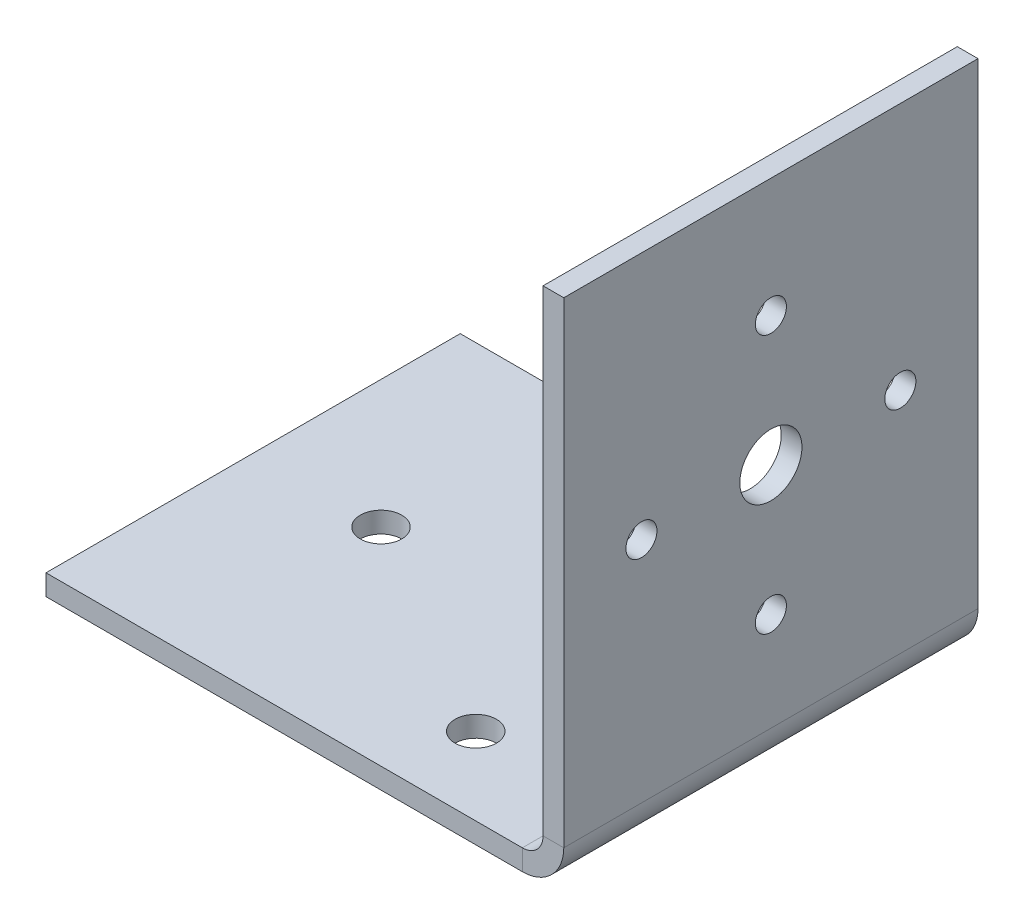
ISO-10303-21;
HEADER;
FILE_DESCRIPTION(('STEP AP214'),'2;1');
FILE_NAME('part.step','',(''),(''),'','','');
FILE_SCHEMA(('AUTOMOTIVE_DESIGN { 1 0 10303 214 1 1 1 1 }'));
ENDSEC;
DATA;
#1=APPLICATION_CONTEXT('core data for automotive mechanical design processes');
#2=APPLICATION_PROTOCOL_DEFINITION('international standard','automotive_design',2000,#1);
#3=PRODUCT_CONTEXT('',#1,'mechanical');
#4=PRODUCT('Part','Part','',(#3));
#5=PRODUCT_RELATED_PRODUCT_CATEGORY('part','',(#4));
#6=PRODUCT_DEFINITION_FORMATION('','',#4);
#7=PRODUCT_DEFINITION_CONTEXT('part definition',#1,'design');
#8=PRODUCT_DEFINITION('design','',#6,#7);
#9=PRODUCT_DEFINITION_SHAPE('','',#8);
#10=(LENGTH_UNIT() NAMED_UNIT(*) SI_UNIT(.MILLI.,.METRE.));
#11=(NAMED_UNIT(*) PLANE_ANGLE_UNIT() SI_UNIT($,.RADIAN.));
#12=(NAMED_UNIT(*) SI_UNIT($,.STERADIAN.) SOLID_ANGLE_UNIT());
#13=UNCERTAINTY_MEASURE_WITH_UNIT(LENGTH_MEASURE(1.E-05),#10,'distance_accuracy_value','');
#14=(GEOMETRIC_REPRESENTATION_CONTEXT(3) GLOBAL_UNCERTAINTY_ASSIGNED_CONTEXT((#13)) GLOBAL_UNIT_ASSIGNED_CONTEXT((#10,
#11,#12)) REPRESENTATION_CONTEXT('',''));
#15=CARTESIAN_POINT('',(0.,0.,0.));
#16=DIRECTION('',(0.,0.,1.));
#17=DIRECTION('',(1.,0.,0.));
#18=AXIS2_PLACEMENT_3D('',#15,#16,#17);
#19=CARTESIAN_POINT('',(25.,0.,-20.));
#20=DIRECTION('',(0.,0.,1.));
#21=DIRECTION('',(0.,1.,0.));
#22=AXIS2_PLACEMENT_3D('',#19,#20,#21);
#23=PLANE('',#22);
#24=DIRECTION('',(1.,0.,0.));
#25=VECTOR('',#24,1.);
#26=CARTESIAN_POINT('',(25.,3.,-20.));
#27=LINE('',#26,#25);
#28=CARTESIAN_POINT('',(23.,3.,-20.));
#29=VERTEX_POINT('',#28);
#30=CARTESIAN_POINT('',(25.,3.,-20.));
#31=VERTEX_POINT('',#30);
#32=EDGE_CURVE('E11',#29,#31,#27,.T.);
#33=ORIENTED_EDGE('',*,*,#32,.F.);
#34=DIRECTION('',(0.,1.,0.));
#35=VECTOR('',#34,1.);
#36=CARTESIAN_POINT('',(23.,0.,-20.));
#37=LINE('',#36,#35);
#38=CARTESIAN_POINT('',(23.,49.,-20.));
#39=VERTEX_POINT('',#38);
#40=EDGE_CURVE('E97',#29,#39,#37,.T.);
#41=ORIENTED_EDGE('',*,*,#40,.T.);
#42=DIRECTION('',(1.,0.,0.));
#43=VECTOR('',#42,1.);
#44=CARTESIAN_POINT('',(25.,49.,-20.));
#45=LINE('',#44,#43);
#46=CARTESIAN_POINT('',(25.,49.,-20.));
#47=VERTEX_POINT('',#46);
#48=EDGE_CURVE('E57',#39,#47,#45,.T.);
#49=ORIENTED_EDGE('',*,*,#48,.T.);
#50=DIRECTION('',(0.,1.,0.));
#51=VECTOR('',#50,1.);
#52=CARTESIAN_POINT('',(25.,0.,-20.));
#53=LINE('',#52,#51);
#54=EDGE_CURVE('E99',#31,#47,#53,.T.);
#55=ORIENTED_EDGE('',*,*,#54,.F.);
#56=EDGE_LOOP('',(#33,#41,#49,#55));
#57=FACE_BOUND('',#56,.T.);
#58=ADVANCED_FACE('F46',(#57),#23,.F.);
#59=CARTESIAN_POINT('',(25.,49.,20.));
#60=DIRECTION('',(0.,1.,0.));
#61=DIRECTION('',(0.,0.,-1.));
#62=AXIS2_PLACEMENT_3D('',#59,#60,#61);
#63=PLANE('',#62);
#64=ORIENTED_EDGE('',*,*,#48,.F.);
#65=DIRECTION('',(0.,0.,1.));
#66=VECTOR('',#65,1.);
#67=CARTESIAN_POINT('',(23.,49.,20.));
#68=LINE('',#67,#66);
#69=CARTESIAN_POINT('',(23.,49.,20.));
#70=VERTEX_POINT('',#69);
#71=EDGE_CURVE('E123',#70,#39,#68,.F.);
#72=ORIENTED_EDGE('',*,*,#71,.F.);
#73=DIRECTION('',(1.,0.,0.));
#74=VECTOR('',#73,1.);
#75=CARTESIAN_POINT('',(25.,49.,20.));
#76=LINE('',#75,#74);
#77=CARTESIAN_POINT('',(25.,49.,20.));
#78=VERTEX_POINT('',#77);
#79=EDGE_CURVE('E155',#70,#78,#76,.T.);
#80=ORIENTED_EDGE('',*,*,#79,.T.);
#81=DIRECTION('',(0.,0.,-1.));
#82=VECTOR('',#81,1.);
#83=CARTESIAN_POINT('',(25.,49.,20.));
#84=LINE('',#83,#82);
#85=EDGE_CURVE('E195',#78,#47,#84,.T.);
#86=ORIENTED_EDGE('',*,*,#85,.T.);
#87=EDGE_LOOP('',(#64,#72,#80,#86));
#88=FACE_BOUND('',#87,.T.);
#89=ADVANCED_FACE('F222',(#88),#63,.T.);
#90=CARTESIAN_POINT('',(25.,0.,20.));
#91=DIRECTION('',(0.,0.,1.));
#92=DIRECTION('',(0.,1.,0.));
#93=AXIS2_PLACEMENT_3D('',#90,#91,#92);
#94=PLANE('',#93);
#95=ORIENTED_EDGE('',*,*,#79,.F.);
#96=DIRECTION('',(0.,1.,0.));
#97=VECTOR('',#96,1.);
#98=CARTESIAN_POINT('',(23.,0.,20.));
#99=LINE('',#98,#97);
#100=CARTESIAN_POINT('',(23.,3.,20.));
#101=VERTEX_POINT('',#100);
#102=EDGE_CURVE('E217',#101,#70,#99,.T.);
#103=ORIENTED_EDGE('',*,*,#102,.F.);
#104=DIRECTION('',(1.,0.,0.));
#105=VECTOR('',#104,1.);
#106=CARTESIAN_POINT('',(25.,3.,20.));
#107=LINE('',#106,#105);
#108=CARTESIAN_POINT('',(25.,3.,20.));
#109=VERTEX_POINT('',#108);
#110=EDGE_CURVE('E148',#101,#109,#107,.T.);
#111=ORIENTED_EDGE('',*,*,#110,.T.);
#112=DIRECTION('',(0.,1.,0.));
#113=VECTOR('',#112,1.);
#114=CARTESIAN_POINT('',(25.,0.,20.));
#115=LINE('',#114,#113);
#116=EDGE_CURVE('E194',#109,#78,#115,.T.);
#117=ORIENTED_EDGE('',*,*,#116,.T.);
#118=EDGE_LOOP('',(#95,#103,#111,#117));
#119=FACE_BOUND('',#118,.T.);
#120=ADVANCED_FACE('F259',(#119),#94,.T.);
#121=CARTESIAN_POINT('',(21.,3.,20.));
#122=DIRECTION('',(0.,0.,-1.));
#123=DIRECTION('',(-1.,0.,0.));
#124=AXIS2_PLACEMENT_3D('',#121,#122,#123);
#125=PLANE('',#124);
#126=ORIENTED_EDGE('',*,*,#110,.F.);
#127=CARTESIAN_POINT('',(21.,3.,20.));
#128=DIRECTION('',(0.,0.,-1.));
#129=DIRECTION('',(-1.,0.,0.));
#130=AXIS2_PLACEMENT_3D('',#127,#128,#129);
#131=CIRCLE('',#130,2.);
#132=CARTESIAN_POINT('',(21.,1.,20.));
#133=VERTEX_POINT('',#132);
#134=EDGE_CURVE('E114',#101,#133,#131,.T.);
#135=ORIENTED_EDGE('',*,*,#134,.T.);
#136=DIRECTION('',(0.,-1.,0.));
#137=VECTOR('',#136,1.);
#138=CARTESIAN_POINT('',(21.,-1.,20.));
#139=LINE('',#138,#137);
#140=CARTESIAN_POINT('',(21.,-1.,20.));
#141=VERTEX_POINT('',#140);
#142=EDGE_CURVE('E64',#133,#141,#139,.T.);
#143=ORIENTED_EDGE('',*,*,#142,.T.);
#144=CARTESIAN_POINT('',(21.,3.,20.));
#145=DIRECTION('',(0.,0.,1.));
#146=DIRECTION('',(1.,0.,0.));
#147=AXIS2_PLACEMENT_3D('',#144,#145,#146);
#148=CIRCLE('',#147,4.);
#149=EDGE_CURVE('E188',#109,#141,#148,.F.);
#150=ORIENTED_EDGE('',*,*,#149,.F.);
#151=EDGE_LOOP('',(#126,#135,#143,#150));
#152=FACE_BOUND('',#151,.T.);
#153=ADVANCED_FACE('F257',(#152),#125,.F.);
#154=CARTESIAN_POINT('',(0.,-1.,20.));
#155=DIRECTION('',(0.,0.,1.));
#156=DIRECTION('',(1.,0.,0.));
#157=AXIS2_PLACEMENT_3D('',#154,#155,#156);
#158=PLANE('',#157);
#159=ORIENTED_EDGE('',*,*,#142,.F.);
#160=DIRECTION('',(1.,0.,0.));
#161=VECTOR('',#160,1.);
#162=CARTESIAN_POINT('',(0.,1.,20.));
#163=LINE('',#162,#161);
#164=CARTESIAN_POINT('',(-25.,1.,20.));
#165=VERTEX_POINT('',#164);
#166=EDGE_CURVE('E220',#165,#133,#163,.T.);
#167=ORIENTED_EDGE('',*,*,#166,.F.);
#168=DIRECTION('',(0.,-1.,0.));
#169=VECTOR('',#168,1.);
#170=CARTESIAN_POINT('',(-25.,-1.,20.));
#171=LINE('',#170,#169);
#172=CARTESIAN_POINT('',(-25.,-1.,20.));
#173=VERTEX_POINT('',#172);
#174=EDGE_CURVE('E143',#165,#173,#171,.T.);
#175=ORIENTED_EDGE('',*,*,#174,.T.);
#176=DIRECTION('',(1.,0.,0.));
#177=VECTOR('',#176,1.);
#178=CARTESIAN_POINT('',(0.,-1.,20.));
#179=LINE('',#178,#177);
#180=EDGE_CURVE('E202',#173,#141,#179,.T.);
#181=ORIENTED_EDGE('',*,*,#180,.T.);
#182=EDGE_LOOP('',(#159,#167,#175,#181));
#183=FACE_BOUND('',#182,.T.);
#184=ADVANCED_FACE('F244',(#183),#158,.T.);
#185=CARTESIAN_POINT('',(-25.,-1.,20.));
#186=DIRECTION('',(1.,0.,0.));
#187=DIRECTION('',(0.,0.,-1.));
#188=AXIS2_PLACEMENT_3D('',#185,#186,#187);
#189=PLANE('',#188);
#190=ORIENTED_EDGE('',*,*,#174,.F.);
#191=DIRECTION('',(0.,0.,1.));
#192=VECTOR('',#191,1.);
#193=CARTESIAN_POINT('',(-25.,1.,20.));
#194=LINE('',#193,#192);
#195=CARTESIAN_POINT('',(-25.,1.,-20.));
#196=VERTEX_POINT('',#195);
#197=EDGE_CURVE('E119',#165,#196,#194,.F.);
#198=ORIENTED_EDGE('',*,*,#197,.T.);
#199=DIRECTION('',(0.,-1.,0.));
#200=VECTOR('',#199,1.);
#201=CARTESIAN_POINT('',(-25.,-1.,-20.));
#202=LINE('',#201,#200);
#203=CARTESIAN_POINT('',(-25.,-1.,-20.));
#204=VERTEX_POINT('',#203);
#205=EDGE_CURVE('E145',#196,#204,#202,.T.);
#206=ORIENTED_EDGE('',*,*,#205,.T.);
#207=DIRECTION('',(0.,0.,-1.));
#208=VECTOR('',#207,1.);
#209=CARTESIAN_POINT('',(-25.,-1.,20.));
#210=LINE('',#209,#208);
#211=EDGE_CURVE('E201',#173,#204,#210,.T.);
#212=ORIENTED_EDGE('',*,*,#211,.F.);
#213=EDGE_LOOP('',(#190,#198,#206,#212));
#214=FACE_BOUND('',#213,.T.);
#215=ADVANCED_FACE('F252',(#214),#189,.F.);
#216=CARTESIAN_POINT('',(0.,-1.,-20.));
#217=DIRECTION('',(0.,0.,1.));
#218=DIRECTION('',(1.,0.,0.));
#219=AXIS2_PLACEMENT_3D('',#216,#217,#218);
#220=PLANE('',#219);
#221=ORIENTED_EDGE('',*,*,#205,.F.);
#222=DIRECTION('',(1.,0.,0.));
#223=VECTOR('',#222,1.);
#224=CARTESIAN_POINT('',(0.,1.,-20.));
#225=LINE('',#224,#223);
#226=CARTESIAN_POINT('',(21.,1.,-20.));
#227=VERTEX_POINT('',#226);
#228=EDGE_CURVE('E214',#196,#227,#225,.T.);
#229=ORIENTED_EDGE('',*,*,#228,.T.);
#230=DIRECTION('',(0.,-1.,0.));
#231=VECTOR('',#230,1.);
#232=CARTESIAN_POINT('',(21.,-1.,-20.));
#233=LINE('',#232,#231);
#234=CARTESIAN_POINT('',(21.,-1.,-20.));
#235=VERTEX_POINT('',#234);
#236=EDGE_CURVE('E129',#227,#235,#233,.T.);
#237=ORIENTED_EDGE('',*,*,#236,.T.);
#238=DIRECTION('',(1.,0.,0.));
#239=VECTOR('',#238,1.);
#240=CARTESIAN_POINT('',(0.,-1.,-20.));
#241=LINE('',#240,#239);
#242=EDGE_CURVE('E199',#204,#235,#241,.T.);
#243=ORIENTED_EDGE('',*,*,#242,.F.);
#244=EDGE_LOOP('',(#221,#229,#237,#243));
#245=FACE_BOUND('',#244,.T.);
#246=ADVANCED_FACE('F253',(#245),#220,.F.);
#247=CARTESIAN_POINT('',(25.,25.02,0.));
#248=DIRECTION('',(-1.,0.,0.));
#249=DIRECTION('',(0.,0.,1.));
#250=AXIS2_PLACEMENT_3D('',#247,#248,#249);
#251=CYLINDRICAL_SURFACE('',#250,3.);
#252=CARTESIAN_POINT('',(25.,25.02,0.));
#253=DIRECTION('',(1.,0.,0.));
#254=DIRECTION('',(0.,0.,-1.));
#255=AXIS2_PLACEMENT_3D('',#252,#253,#254);
#256=CIRCLE('',#255,3.);
#257=CARTESIAN_POINT('',(25.,25.02,-3.));
#258=VERTEX_POINT('',#257);
#259=EDGE_CURVE('E190',#258,#258,#256,.T.);
#260=ORIENTED_EDGE('',*,*,#259,.T.);
#261=EDGE_LOOP('',(#260));
#262=FACE_BOUND('',#261,.T.);
#263=CARTESIAN_POINT('',(23.,25.02,0.));
#264=DIRECTION('',(1.,0.,0.));
#265=DIRECTION('',(0.,0.,-1.));
#266=AXIS2_PLACEMENT_3D('',#263,#264,#265);
#267=CIRCLE('',#266,3.);
#268=CARTESIAN_POINT('',(23.,25.02,-3.));
#269=VERTEX_POINT('',#268);
#270=EDGE_CURVE('E126',#269,#269,#267,.T.);
#271=ORIENTED_EDGE('',*,*,#270,.F.);
#272=EDGE_LOOP('',(#271));
#273=FACE_BOUND('',#272,.T.);
#274=ADVANCED_FACE('F48',(#262,#273),#251,.F.);
#275=CARTESIAN_POINT('',(21.,3.,-20.));
#276=DIRECTION('',(0.,0.,1.));
#277=DIRECTION('',(1.,0.,0.));
#278=AXIS2_PLACEMENT_3D('',#275,#276,#277);
#279=PLANE('',#278);
#280=CARTESIAN_POINT('',(21.,3.,-20.));
#281=DIRECTION('',(0.,0.,-1.));
#282=DIRECTION('',(-1.,0.,0.));
#283=AXIS2_PLACEMENT_3D('',#280,#281,#282);
#284=CIRCLE('',#283,2.);
#285=EDGE_CURVE('E113',#227,#29,#284,.F.);
#286=ORIENTED_EDGE('',*,*,#285,.T.);
#287=ORIENTED_EDGE('',*,*,#32,.T.);
#288=CARTESIAN_POINT('',(21.,3.,-20.));
#289=DIRECTION('',(0.,0.,-1.));
#290=DIRECTION('',(-1.,0.,0.));
#291=AXIS2_PLACEMENT_3D('',#288,#289,#290);
#292=CIRCLE('',#291,4.);
#293=EDGE_CURVE('E211',#235,#31,#292,.F.);
#294=ORIENTED_EDGE('',*,*,#293,.F.);
#295=ORIENTED_EDGE('',*,*,#236,.F.);
#296=EDGE_LOOP('',(#286,#287,#294,#295));
#297=FACE_BOUND('',#296,.T.);
#298=ADVANCED_FACE('F128',(#297),#279,.F.);
#299=CARTESIAN_POINT('',(0.,-1.,20.));
#300=DIRECTION('',(0.,1.,0.));
#301=DIRECTION('',(0.,0.,1.));
#302=AXIS2_PLACEMENT_3D('',#299,#300,#301);
#303=PLANE('',#302);
#304=CARTESIAN_POINT('',(8.9999999999999,-1.,12.5000000000001));
#305=DIRECTION('',(0.,-1.,0.));
#306=DIRECTION('',(0.,0.,-1.));
#307=AXIS2_PLACEMENT_3D('',#304,#305,#306);
#308=CIRCLE('',#307,2.);
#309=CARTESIAN_POINT('',(8.9999999999999,-1.,10.5000000000001));
#310=VERTEX_POINT('',#309);
#311=EDGE_CURVE('E163',#310,#310,#308,.T.);
#312=ORIENTED_EDGE('',*,*,#311,.F.);
#313=EDGE_LOOP('',(#312));
#314=FACE_BOUND('',#313,.T.);
#315=CARTESIAN_POINT('',(8.9999999999999,-1.,-12.4999999999999));
#316=DIRECTION('',(0.,-1.,0.));
#317=DIRECTION('',(0.,0.,-1.));
#318=AXIS2_PLACEMENT_3D('',#315,#316,#317);
#319=CIRCLE('',#318,2.);
#320=CARTESIAN_POINT('',(8.9999999999999,-1.,-14.4999999999999));
#321=VERTEX_POINT('',#320);
#322=EDGE_CURVE('E177',#321,#321,#319,.T.);
#323=ORIENTED_EDGE('',*,*,#322,.F.);
#324=EDGE_LOOP('',(#323));
#325=FACE_BOUND('',#324,.T.);
#326=CARTESIAN_POINT('',(-12.6506350946111,-1.,0.));
#327=DIRECTION('',(0.,-1.,0.));
#328=DIRECTION('',(0.,0.,-1.));
#329=AXIS2_PLACEMENT_3D('',#326,#327,#328);
#330=CIRCLE('',#329,2.);
#331=CARTESIAN_POINT('',(-12.6506350946111,-1.,-1.99999999999994));
#332=VERTEX_POINT('',#331);
#333=EDGE_CURVE('E174',#332,#332,#330,.T.);
#334=ORIENTED_EDGE('',*,*,#333,.F.);
#335=EDGE_LOOP('',(#334));
#336=FACE_BOUND('',#335,.T.);
#337=ORIENTED_EDGE('',*,*,#242,.T.);
#338=DIRECTION('',(0.,0.,-1.));
#339=VECTOR('',#338,1.);
#340=CARTESIAN_POINT('',(21.,-1.,20.));
#341=LINE('',#340,#339);
#342=EDGE_CURVE('E160',#235,#141,#341,.F.);
#343=ORIENTED_EDGE('',*,*,#342,.T.);
#344=ORIENTED_EDGE('',*,*,#180,.F.);
#345=ORIENTED_EDGE('',*,*,#211,.T.);
#346=EDGE_LOOP('',(#337,#343,#344,#345));
#347=FACE_BOUND('',#346,.T.);
#348=ADVANCED_FACE('F249',(#314,#325,#336,#347),#303,.F.);
#349=CARTESIAN_POINT('',(25.,0.,20.));
#350=DIRECTION('',(-1.,0.,0.));
#351=DIRECTION('',(0.,0.,1.));
#352=AXIS2_PLACEMENT_3D('',#349,#350,#351);
#353=PLANE('',#352);
#354=CARTESIAN_POINT('',(25.,37.52,0.));
#355=DIRECTION('',(1.,0.,0.));
#356=DIRECTION('',(0.,0.,-1.));
#357=AXIS2_PLACEMENT_3D('',#354,#355,#356);
#358=CIRCLE('',#357,1.5);
#359=CARTESIAN_POINT('',(25.,37.52,-1.5));
#360=VERTEX_POINT('',#359);
#361=EDGE_CURVE('E166',#360,#360,#358,.T.);
#362=ORIENTED_EDGE('',*,*,#361,.F.);
#363=EDGE_LOOP('',(#362));
#364=FACE_BOUND('',#363,.T.);
#365=CARTESIAN_POINT('',(25.,25.02,-12.5));
#366=DIRECTION('',(1.,0.,0.));
#367=DIRECTION('',(0.,0.,-1.));
#368=AXIS2_PLACEMENT_3D('',#365,#366,#367);
#369=CIRCLE('',#368,1.5);
#370=CARTESIAN_POINT('',(25.,25.02,-14.));
#371=VERTEX_POINT('',#370);
#372=EDGE_CURVE('E523',#371,#371,#369,.T.);
#373=ORIENTED_EDGE('',*,*,#372,.F.);
#374=EDGE_LOOP('',(#373));
#375=FACE_BOUND('',#374,.T.);
#376=CARTESIAN_POINT('',(25.,12.52,0.));
#377=DIRECTION('',(1.,0.,0.));
#378=DIRECTION('',(0.,0.,-1.));
#379=AXIS2_PLACEMENT_3D('',#376,#377,#378);
#380=CIRCLE('',#379,1.5);
#381=CARTESIAN_POINT('',(25.,12.52,-1.5));
#382=VERTEX_POINT('',#381);
#383=EDGE_CURVE('E529',#382,#382,#380,.T.);
#384=ORIENTED_EDGE('',*,*,#383,.F.);
#385=EDGE_LOOP('',(#384));
#386=FACE_BOUND('',#385,.T.);
#387=CARTESIAN_POINT('',(25.,25.02,12.5));
#388=DIRECTION('',(1.,0.,0.));
#389=DIRECTION('',(0.,0.,-1.));
#390=AXIS2_PLACEMENT_3D('',#387,#388,#389);
#391=CIRCLE('',#390,1.5);
#392=CARTESIAN_POINT('',(25.,25.02,11.));
#393=VERTEX_POINT('',#392);
#394=EDGE_CURVE('E535',#393,#393,#391,.T.);
#395=ORIENTED_EDGE('',*,*,#394,.F.);
#396=EDGE_LOOP('',(#395));
#397=FACE_BOUND('',#396,.T.);
#398=ORIENTED_EDGE('',*,*,#259,.F.);
#399=EDGE_LOOP('',(#398));
#400=FACE_BOUND('',#399,.T.);
#401=ORIENTED_EDGE('',*,*,#116,.F.);
#402=DIRECTION('',(0.,0.,-1.));
#403=VECTOR('',#402,1.);
#404=CARTESIAN_POINT('',(25.,3.,20.));
#405=LINE('',#404,#403);
#406=EDGE_CURVE('E210',#109,#31,#405,.T.);
#407=ORIENTED_EDGE('',*,*,#406,.T.);
#408=ORIENTED_EDGE('',*,*,#54,.T.);
#409=ORIENTED_EDGE('',*,*,#85,.F.);
#410=EDGE_LOOP('',(#401,#407,#408,#409));
#411=FACE_BOUND('',#410,.T.);
#412=ADVANCED_FACE('F233',(#364,#375,#386,#397,#400,#411),#353,.F.);
#413=CARTESIAN_POINT('',(21.,3.,20.));
#414=DIRECTION('',(0.,0.,-1.));
#415=DIRECTION('',(-1.,0.,0.));
#416=AXIS2_PLACEMENT_3D('',#413,#414,#415);
#417=CYLINDRICAL_SURFACE('',#416,4.);
#418=ORIENTED_EDGE('',*,*,#149,.T.);
#419=ORIENTED_EDGE('',*,*,#342,.F.);
#420=ORIENTED_EDGE('',*,*,#293,.T.);
#421=ORIENTED_EDGE('',*,*,#406,.F.);
#422=EDGE_LOOP('',(#418,#419,#420,#421));
#423=FACE_BOUND('',#422,.T.);
#424=ADVANCED_FACE('F236',(#423),#417,.T.);
#425=CARTESIAN_POINT('',(0.,1.,20.));
#426=DIRECTION('',(0.,1.,0.));
#427=DIRECTION('',(0.,0.,1.));
#428=AXIS2_PLACEMENT_3D('',#425,#426,#427);
#429=PLANE('',#428);
#430=CARTESIAN_POINT('',(8.9999999999999,1.,12.5000000000001));
#431=DIRECTION('',(0.,1.,0.));
#432=DIRECTION('',(0.,0.,1.));
#433=AXIS2_PLACEMENT_3D('',#430,#431,#432);
#434=CIRCLE('',#433,2.);
#435=CARTESIAN_POINT('',(8.9999999999999,1.,14.5000000000001));
#436=VERTEX_POINT('',#435);
#437=EDGE_CURVE('E132',#436,#436,#434,.T.);
#438=ORIENTED_EDGE('',*,*,#437,.F.);
#439=EDGE_LOOP('',(#438));
#440=FACE_BOUND('',#439,.T.);
#441=CARTESIAN_POINT('',(8.9999999999999,1.,-12.4999999999999));
#442=DIRECTION('',(0.,1.,0.));
#443=DIRECTION('',(0.,0.,1.));
#444=AXIS2_PLACEMENT_3D('',#441,#442,#443);
#445=CIRCLE('',#444,2.);
#446=CARTESIAN_POINT('',(8.9999999999999,1.,-10.4999999999999));
#447=VERTEX_POINT('',#446);
#448=EDGE_CURVE('E137',#447,#447,#445,.T.);
#449=ORIENTED_EDGE('',*,*,#448,.F.);
#450=EDGE_LOOP('',(#449));
#451=FACE_BOUND('',#450,.T.);
#452=CARTESIAN_POINT('',(-12.6506350946111,1.,0.));
#453=DIRECTION('',(0.,1.,0.));
#454=DIRECTION('',(0.,0.,1.));
#455=AXIS2_PLACEMENT_3D('',#452,#453,#454);
#456=CIRCLE('',#455,2.);
#457=CARTESIAN_POINT('',(-12.6506350946111,1.,2.00000000000006));
#458=VERTEX_POINT('',#457);
#459=EDGE_CURVE('E156',#458,#458,#456,.T.);
#460=ORIENTED_EDGE('',*,*,#459,.F.);
#461=EDGE_LOOP('',(#460));
#462=FACE_BOUND('',#461,.T.);
#463=ORIENTED_EDGE('',*,*,#228,.F.);
#464=ORIENTED_EDGE('',*,*,#197,.F.);
#465=ORIENTED_EDGE('',*,*,#166,.T.);
#466=DIRECTION('',(0.,0.,1.));
#467=VECTOR('',#466,1.);
#468=CARTESIAN_POINT('',(21.,1.,20.));
#469=LINE('',#468,#467);
#470=EDGE_CURVE('E118',#227,#133,#469,.T.);
#471=ORIENTED_EDGE('',*,*,#470,.F.);
#472=EDGE_LOOP('',(#463,#464,#465,#471));
#473=FACE_BOUND('',#472,.T.);
#474=ADVANCED_FACE('F260',(#440,#451,#462,#473),#429,.T.);
#475=CARTESIAN_POINT('',(23.,0.,20.));
#476=DIRECTION('',(-1.,0.,0.));
#477=DIRECTION('',(0.,0.,1.));
#478=AXIS2_PLACEMENT_3D('',#475,#476,#477);
#479=PLANE('',#478);
#480=CARTESIAN_POINT('',(23.,37.52,0.));
#481=DIRECTION('',(-1.,0.,0.));
#482=DIRECTION('',(0.,0.,1.));
#483=AXIS2_PLACEMENT_3D('',#480,#481,#482);
#484=CIRCLE('',#483,1.5);
#485=CARTESIAN_POINT('',(23.,37.52,1.5));
#486=VERTEX_POINT('',#485);
#487=EDGE_CURVE('E49',#486,#486,#484,.T.);
#488=ORIENTED_EDGE('',*,*,#487,.F.);
#489=EDGE_LOOP('',(#488));
#490=FACE_BOUND('',#489,.T.);
#491=CARTESIAN_POINT('',(23.,25.02,-12.5));
#492=DIRECTION('',(-1.,0.,0.));
#493=DIRECTION('',(0.,0.,1.));
#494=AXIS2_PLACEMENT_3D('',#491,#492,#493);
#495=CIRCLE('',#494,1.5);
#496=CARTESIAN_POINT('',(23.,25.02,-11.));
#497=VERTEX_POINT('',#496);
#498=EDGE_CURVE('E167',#497,#497,#495,.T.);
#499=ORIENTED_EDGE('',*,*,#498,.F.);
#500=EDGE_LOOP('',(#499));
#501=FACE_BOUND('',#500,.T.);
#502=CARTESIAN_POINT('',(23.,12.52,0.));
#503=DIRECTION('',(-1.,0.,0.));
#504=DIRECTION('',(0.,0.,1.));
#505=AXIS2_PLACEMENT_3D('',#502,#503,#504);
#506=CIRCLE('',#505,1.5);
#507=CARTESIAN_POINT('',(23.,12.52,1.5));
#508=VERTEX_POINT('',#507);
#509=EDGE_CURVE('E170',#508,#508,#506,.T.);
#510=ORIENTED_EDGE('',*,*,#509,.F.);
#511=EDGE_LOOP('',(#510));
#512=FACE_BOUND('',#511,.T.);
#513=CARTESIAN_POINT('',(23.,25.02,12.5));
#514=DIRECTION('',(-1.,0.,0.));
#515=DIRECTION('',(0.,0.,1.));
#516=AXIS2_PLACEMENT_3D('',#513,#514,#515);
#517=CIRCLE('',#516,1.5);
#518=CARTESIAN_POINT('',(23.,25.02,14.));
#519=VERTEX_POINT('',#518);
#520=EDGE_CURVE('E165',#519,#519,#517,.T.);
#521=ORIENTED_EDGE('',*,*,#520,.F.);
#522=EDGE_LOOP('',(#521));
#523=FACE_BOUND('',#522,.T.);
#524=ORIENTED_EDGE('',*,*,#270,.T.);
#525=EDGE_LOOP('',(#524));
#526=FACE_BOUND('',#525,.T.);
#527=ORIENTED_EDGE('',*,*,#102,.T.);
#528=ORIENTED_EDGE('',*,*,#71,.T.);
#529=ORIENTED_EDGE('',*,*,#40,.F.);
#530=DIRECTION('',(0.,0.,1.));
#531=VECTOR('',#530,1.);
#532=CARTESIAN_POINT('',(23.,3.,20.));
#533=LINE('',#532,#531);
#534=EDGE_CURVE('E109',#101,#29,#533,.F.);
#535=ORIENTED_EDGE('',*,*,#534,.F.);
#536=EDGE_LOOP('',(#527,#528,#529,#535));
#537=FACE_BOUND('',#536,.T.);
#538=ADVANCED_FACE('F124',(#490,#501,#512,#523,#526,#537),#479,.T.);
#539=CARTESIAN_POINT('',(21.,3.,20.));
#540=DIRECTION('',(0.,0.,-1.));
#541=DIRECTION('',(-1.,0.,0.));
#542=AXIS2_PLACEMENT_3D('',#539,#540,#541);
#543=CYLINDRICAL_SURFACE('',#542,2.);
#544=ORIENTED_EDGE('',*,*,#134,.F.);
#545=ORIENTED_EDGE('',*,*,#534,.T.);
#546=ORIENTED_EDGE('',*,*,#285,.F.);
#547=ORIENTED_EDGE('',*,*,#470,.T.);
#548=EDGE_LOOP('',(#544,#545,#546,#547));
#549=FACE_BOUND('',#548,.T.);
#550=ADVANCED_FACE('F111',(#549),#543,.F.);
#551=CARTESIAN_POINT('',(-12.6506350946111,9.,0.));
#552=DIRECTION('',(0.,-1.,0.));
#553=DIRECTION('',(0.,0.,-1.));
#554=AXIS2_PLACEMENT_3D('',#551,#552,#553);
#555=CYLINDRICAL_SURFACE('',#554,2.);
#556=ORIENTED_EDGE('',*,*,#459,.T.);
#557=EDGE_LOOP('',(#556));
#558=FACE_BOUND('',#557,.T.);
#559=ORIENTED_EDGE('',*,*,#333,.T.);
#560=EDGE_LOOP('',(#559));
#561=FACE_BOUND('',#560,.T.);
#562=ADVANCED_FACE('F299',(#558,#561),#555,.F.);
#563=CARTESIAN_POINT('',(8.9999999999999,9.,-12.4999999999999));
#564=DIRECTION('',(0.,-1.,0.));
#565=DIRECTION('',(0.,0.,-1.));
#566=AXIS2_PLACEMENT_3D('',#563,#564,#565);
#567=CYLINDRICAL_SURFACE('',#566,2.);
#568=ORIENTED_EDGE('',*,*,#448,.T.);
#569=EDGE_LOOP('',(#568));
#570=FACE_BOUND('',#569,.T.);
#571=ORIENTED_EDGE('',*,*,#322,.T.);
#572=EDGE_LOOP('',(#571));
#573=FACE_BOUND('',#572,.T.);
#574=ADVANCED_FACE('F386',(#570,#573),#567,.F.);
#575=CARTESIAN_POINT('',(8.9999999999999,9.,12.5000000000001));
#576=DIRECTION('',(0.,-1.,0.));
#577=DIRECTION('',(0.,0.,-1.));
#578=AXIS2_PLACEMENT_3D('',#575,#576,#577);
#579=CYLINDRICAL_SURFACE('',#578,2.);
#580=ORIENTED_EDGE('',*,*,#437,.T.);
#581=EDGE_LOOP('',(#580));
#582=FACE_BOUND('',#581,.T.);
#583=ORIENTED_EDGE('',*,*,#311,.T.);
#584=EDGE_LOOP('',(#583));
#585=FACE_BOUND('',#584,.T.);
#586=ADVANCED_FACE('F399',(#582,#585),#579,.F.);
#587=CARTESIAN_POINT('',(17.,25.02,12.5));
#588=DIRECTION('',(1.,0.,0.));
#589=DIRECTION('',(0.,0.,-1.));
#590=AXIS2_PLACEMENT_3D('',#587,#588,#589);
#591=CYLINDRICAL_SURFACE('',#590,1.5);
#592=ORIENTED_EDGE('',*,*,#520,.T.);
#593=EDGE_LOOP('',(#592));
#594=FACE_BOUND('',#593,.T.);
#595=ORIENTED_EDGE('',*,*,#394,.T.);
#596=EDGE_LOOP('',(#595));
#597=FACE_BOUND('',#596,.T.);
#598=ADVANCED_FACE('F410',(#594,#597),#591,.F.);
#599=CARTESIAN_POINT('',(17.,12.52,0.));
#600=DIRECTION('',(1.,0.,0.));
#601=DIRECTION('',(0.,0.,-1.));
#602=AXIS2_PLACEMENT_3D('',#599,#600,#601);
#603=CYLINDRICAL_SURFACE('',#602,1.5);
#604=ORIENTED_EDGE('',*,*,#509,.T.);
#605=EDGE_LOOP('',(#604));
#606=FACE_BOUND('',#605,.T.);
#607=ORIENTED_EDGE('',*,*,#383,.T.);
#608=EDGE_LOOP('',(#607));
#609=FACE_BOUND('',#608,.T.);
#610=ADVANCED_FACE('F420',(#606,#609),#603,.F.);
#611=CARTESIAN_POINT('',(17.,25.02,-12.5));
#612=DIRECTION('',(1.,0.,0.));
#613=DIRECTION('',(0.,0.,-1.));
#614=AXIS2_PLACEMENT_3D('',#611,#612,#613);
#615=CYLINDRICAL_SURFACE('',#614,1.5);
#616=ORIENTED_EDGE('',*,*,#498,.T.);
#617=EDGE_LOOP('',(#616));
#618=FACE_BOUND('',#617,.T.);
#619=ORIENTED_EDGE('',*,*,#372,.T.);
#620=EDGE_LOOP('',(#619));
#621=FACE_BOUND('',#620,.T.);
#622=ADVANCED_FACE('F426',(#618,#621),#615,.F.);
#623=CARTESIAN_POINT('',(17.,37.52,0.));
#624=DIRECTION('',(1.,0.,0.));
#625=DIRECTION('',(0.,0.,-1.));
#626=AXIS2_PLACEMENT_3D('',#623,#624,#625);
#627=CYLINDRICAL_SURFACE('',#626,1.5);
#628=ORIENTED_EDGE('',*,*,#487,.T.);
#629=EDGE_LOOP('',(#628));
#630=FACE_BOUND('',#629,.T.);
#631=ORIENTED_EDGE('',*,*,#361,.T.);
#632=EDGE_LOOP('',(#631));
#633=FACE_BOUND('',#632,.T.);
#634=ADVANCED_FACE('F437',(#630,#633),#627,.F.);
#635=CLOSED_SHELL('',(#58,#89,#120,#153,#184,#215,#246,#274,#298,#348,#412,#424,#474,#538,#550,
#562,#574,#586,#598,#610,#622,#634));
#636=MANIFOLD_SOLID_BREP('B2',#635);
#637=ADVANCED_BREP_SHAPE_REPRESENTATION('',(#18,#636),#14);
#638=SHAPE_DEFINITION_REPRESENTATION(#9,#637);
ENDSEC;
END-ISO-10303-21;
